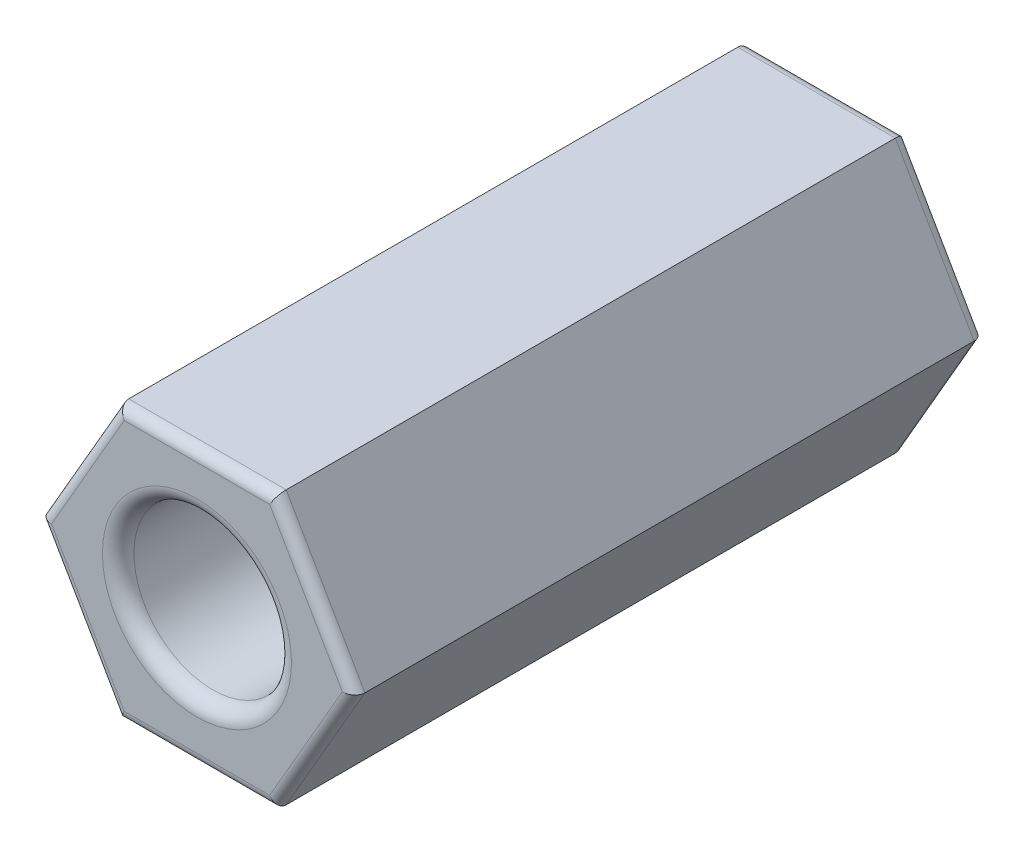
ISO-10303-21;
HEADER;
FILE_DESCRIPTION(('STEP AP214'),'2;1');
FILE_NAME('part.step','',(''),(''),'','','');
FILE_SCHEMA(('AUTOMOTIVE_DESIGN { 1 0 10303 214 1 1 1 1 }'));
ENDSEC;
DATA;
#1=APPLICATION_CONTEXT('core data for automotive mechanical design processes');
#2=APPLICATION_PROTOCOL_DEFINITION('international standard','automotive_design',2000,#1);
#3=PRODUCT_CONTEXT('',#1,'mechanical');
#4=PRODUCT('Part','Part','',(#3));
#5=PRODUCT_RELATED_PRODUCT_CATEGORY('part','',(#4));
#6=PRODUCT_DEFINITION_FORMATION('','',#4);
#7=PRODUCT_DEFINITION_CONTEXT('part definition',#1,'design');
#8=PRODUCT_DEFINITION('design','',#6,#7);
#9=PRODUCT_DEFINITION_SHAPE('','',#8);
#10=(LENGTH_UNIT() NAMED_UNIT(*) SI_UNIT(.MILLI.,.METRE.));
#11=(NAMED_UNIT(*) PLANE_ANGLE_UNIT() SI_UNIT($,.RADIAN.));
#12=(NAMED_UNIT(*) SI_UNIT($,.STERADIAN.) SOLID_ANGLE_UNIT());
#13=UNCERTAINTY_MEASURE_WITH_UNIT(LENGTH_MEASURE(1.E-05),#10,'distance_accuracy_value','');
#14=(GEOMETRIC_REPRESENTATION_CONTEXT(3) GLOBAL_UNCERTAINTY_ASSIGNED_CONTEXT((#13)) GLOBAL_UNIT_ASSIGNED_CONTEXT((#10,
#11,#12)) REPRESENTATION_CONTEXT('',''));
#15=CARTESIAN_POINT('',(0.,0.,0.));
#16=DIRECTION('',(0.,0.,1.));
#17=DIRECTION('',(1.,0.,0.));
#18=AXIS2_PLACEMENT_3D('',#15,#16,#17);
#19=CARTESIAN_POINT('',(0.,0.,12.));
#20=DIRECTION('',(0.,0.,1.));
#21=DIRECTION('',(1.,0.,0.));
#22=AXIS2_PLACEMENT_3D('',#19,#20,#21);
#23=PLANE('',#22);
#24=DIRECTION('',(-1.,0.,0.));
#25=VECTOR('',#24,1.);
#26=CARTESIAN_POINT('',(-1.50000000000001,2.39807621135331,12.));
#27=LINE('',#26,#25);
#28=CARTESIAN_POINT('',(1.38452994616207,2.39807621135332,12.));
#29=VERTEX_POINT('',#28);
#30=CARTESIAN_POINT('',(-1.38452994616209,2.39807621135331,12.));
#31=VERTEX_POINT('',#30);
#32=EDGE_CURVE('E128',#29,#31,#27,.T.);
#33=ORIENTED_EDGE('',*,*,#32,.T.);
#34=DIRECTION('',(-0.499999999999995,-0.866025403784442,0.));
#35=VECTOR('',#34,1.);
#36=CARTESIAN_POINT('',(-2.82679491924311,-0.10000000000002,12.));
#37=LINE('',#36,#35);
#38=CARTESIAN_POINT('',(-2.76905989232415,0.,12.));
#39=VERTEX_POINT('',#38);
#40=EDGE_CURVE('E161',#31,#39,#37,.T.);
#41=ORIENTED_EDGE('',*,*,#40,.T.);
#42=DIRECTION('',(0.500000000000007,-0.866025403784434,0.));
#43=VECTOR('',#42,1.);
#44=CARTESIAN_POINT('',(-1.32679491924309,-2.49807621135333,12.));
#45=LINE('',#44,#43);
#46=CARTESIAN_POINT('',(-1.38452994616205,-2.39807621135333,12.));
#47=VERTEX_POINT('',#46);
#48=EDGE_CURVE('E159',#39,#47,#45,.T.);
#49=ORIENTED_EDGE('',*,*,#48,.T.);
#50=DIRECTION('',(1.,0.,0.));
#51=VECTOR('',#50,1.);
#52=CARTESIAN_POINT('',(1.50000000000003,-2.3980762113533,12.));
#53=LINE('',#52,#51);
#54=CARTESIAN_POINT('',(1.3845299461621,-2.3980762113533,12.));
#55=VERTEX_POINT('',#54);
#56=EDGE_CURVE('E157',#47,#55,#53,.T.);
#57=ORIENTED_EDGE('',*,*,#56,.T.);
#58=DIRECTION('',(0.499999999999995,0.866025403784442,0.));
#59=VECTOR('',#58,1.);
#60=CARTESIAN_POINT('',(2.82679491924311,0.0999999999999996,12.));
#61=LINE('',#60,#59);
#62=CARTESIAN_POINT('',(2.76905989232415,0.,12.));
#63=VERTEX_POINT('',#62);
#64=EDGE_CURVE('E131',#55,#63,#61,.T.);
#65=ORIENTED_EDGE('',*,*,#64,.T.);
#66=DIRECTION('',(-0.500000000000001,0.866025403784438,0.));
#67=VECTOR('',#66,1.);
#68=CARTESIAN_POINT('',(1.32679491924311,2.49807621135332,12.));
#69=LINE('',#68,#67);
#70=EDGE_CURVE('E123',#63,#29,#69,.T.);
#71=ORIENTED_EDGE('',*,*,#70,.T.);
#72=EDGE_LOOP('',(#33,#41,#49,#57,#65,#71));
#73=FACE_BOUND('',#72,.T.);
#74=CARTESIAN_POINT('',(0.,0.,12.));
#75=DIRECTION('',(0.,0.,1.));
#76=DIRECTION('',(1.,0.,0.));
#77=AXIS2_PLACEMENT_3D('',#74,#75,#76);
#78=CIRCLE('',#77,1.8);
#79=CARTESIAN_POINT('',(1.8,0.,12.));
#80=VERTEX_POINT('',#79);
#81=EDGE_CURVE('E149',#80,#80,#78,.F.);
#82=ORIENTED_EDGE('',*,*,#81,.T.);
#83=EDGE_LOOP('',(#82));
#84=FACE_BOUND('',#83,.T.);
#85=ADVANCED_FACE('F33',(#73,#84),#23,.T.);
#86=CARTESIAN_POINT('',(0.,0.,0.));
#87=DIRECTION('',(0.,0.,1.));
#88=DIRECTION('',(1.,0.,0.));
#89=AXIS2_PLACEMENT_3D('',#86,#87,#88);
#90=PLANE('',#89);
#91=DIRECTION('',(-0.500000000000001,0.866025403784438,0.));
#92=VECTOR('',#91,1.);
#93=CARTESIAN_POINT('',(2.07679491924311,1.19903810567666,0.));
#94=LINE('',#93,#92);
#95=CARTESIAN_POINT('',(1.38452994616207,2.39807621135332,0.));
#96=VERTEX_POINT('',#95);
#97=CARTESIAN_POINT('',(2.76905989232415,0.,0.));
#98=VERTEX_POINT('',#97);
#99=EDGE_CURVE('E188',#96,#98,#94,.F.);
#100=ORIENTED_EDGE('',*,*,#99,.T.);
#101=DIRECTION('',(0.499999999999995,0.866025403784442,0.));
#102=VECTOR('',#101,1.);
#103=CARTESIAN_POINT('',(2.07679491924313,-1.19903810567665,0.));
#104=LINE('',#103,#102);
#105=CARTESIAN_POINT('',(1.3845299461621,-2.3980762113533,0.));
#106=VERTEX_POINT('',#105);
#107=EDGE_CURVE('E11',#98,#106,#104,.F.);
#108=ORIENTED_EDGE('',*,*,#107,.T.);
#109=DIRECTION('',(1.,0.,0.));
#110=VECTOR('',#109,1.);
#111=CARTESIAN_POINT('',(0.,-2.39807621135331,0.));
#112=LINE('',#111,#110);
#113=CARTESIAN_POINT('',(-1.38452994616205,-2.39807621135333,0.));
#114=VERTEX_POINT('',#113);
#115=EDGE_CURVE('E42',#106,#114,#112,.F.);
#116=ORIENTED_EDGE('',*,*,#115,.T.);
#117=DIRECTION('',(0.500000000000007,-0.866025403784434,0.));
#118=VECTOR('',#117,1.);
#119=CARTESIAN_POINT('',(-2.0767949192431,-1.19903810567667,0.));
#120=LINE('',#119,#118);
#121=CARTESIAN_POINT('',(-2.76905989232415,0.,0.));
#122=VERTEX_POINT('',#121);
#123=EDGE_CURVE('E194',#114,#122,#120,.F.);
#124=ORIENTED_EDGE('',*,*,#123,.T.);
#125=DIRECTION('',(-0.499999999999995,-0.866025403784442,0.));
#126=VECTOR('',#125,1.);
#127=CARTESIAN_POINT('',(-2.07679491924312,1.19903810567665,0.));
#128=LINE('',#127,#126);
#129=CARTESIAN_POINT('',(-1.38452994616209,2.39807621135331,0.));
#130=VERTEX_POINT('',#129);
#131=EDGE_CURVE('E192',#122,#130,#128,.F.);
#132=ORIENTED_EDGE('',*,*,#131,.T.);
#133=DIRECTION('',(-1.,0.,0.));
#134=VECTOR('',#133,1.);
#135=CARTESIAN_POINT('',(0.,2.39807621135331,0.));
#136=LINE('',#135,#134);
#137=EDGE_CURVE('E190',#130,#96,#136,.F.);
#138=ORIENTED_EDGE('',*,*,#137,.T.);
#139=EDGE_LOOP('',(#100,#108,#116,#124,#132,#138));
#140=FACE_BOUND('',#139,.T.);
#141=CARTESIAN_POINT('',(0.,0.,0.));
#142=DIRECTION('',(0.,0.,1.));
#143=DIRECTION('',(1.,0.,0.));
#144=AXIS2_PLACEMENT_3D('',#141,#142,#143);
#145=CIRCLE('',#144,1.8);
#146=CARTESIAN_POINT('',(1.8,0.,0.));
#147=VERTEX_POINT('',#146);
#148=EDGE_CURVE('E252',#147,#147,#145,.T.);
#149=ORIENTED_EDGE('',*,*,#148,.T.);
#150=EDGE_LOOP('',(#149));
#151=FACE_BOUND('',#150,.T.);
#152=ADVANCED_FACE('F230',(#140,#151),#90,.F.);
#153=CARTESIAN_POINT('',(1.50000000000003,-2.5980762113533,12.));
#154=DIRECTION('',(-0.866025403784441,0.499999999999995,0.));
#155=DIRECTION('',(-0.499999999999995,-0.866025403784442,0.));
#156=AXIS2_PLACEMENT_3D('',#153,#154,#155);
#157=PLANE('',#156);
#158=DIRECTION('',(0.,0.,-1.));
#159=VECTOR('',#158,1.);
#160=CARTESIAN_POINT('',(3.,0.,12.));
#161=LINE('',#160,#159);
#162=CARTESIAN_POINT('',(3.,0.,11.8));
#163=VERTEX_POINT('',#162);
#164=CARTESIAN_POINT('',(3.,0.,0.200000000000001));
#165=VERTEX_POINT('',#164);
#166=EDGE_CURVE('E245',#163,#165,#161,.T.);
#167=ORIENTED_EDGE('',*,*,#166,.F.);
#168=DIRECTION('',(0.499999999999995,0.866025403784442,0.));
#169=VECTOR('',#168,1.);
#170=CARTESIAN_POINT('',(1.50000000000003,-2.5980762113533,11.8));
#171=LINE('',#170,#169);
#172=CARTESIAN_POINT('',(1.50000000000003,-2.5980762113533,11.8));
#173=VERTEX_POINT('',#172);
#174=EDGE_CURVE('E179',#163,#173,#171,.F.);
#175=ORIENTED_EDGE('',*,*,#174,.T.);
#176=DIRECTION('',(0.,0.,-1.));
#177=VECTOR('',#176,1.);
#178=CARTESIAN_POINT('',(1.50000000000003,-2.5980762113533,12.));
#179=LINE('',#178,#177);
#180=CARTESIAN_POINT('',(1.50000000000003,-2.5980762113533,0.200000000000001));
#181=VERTEX_POINT('',#180);
#182=EDGE_CURVE('E206',#173,#181,#179,.T.);
#183=ORIENTED_EDGE('',*,*,#182,.T.);
#184=DIRECTION('',(0.499999999999995,0.866025403784442,0.));
#185=VECTOR('',#184,1.);
#186=CARTESIAN_POINT('',(1.50000000000003,-2.5980762113533,0.200000000000001));
#187=LINE('',#186,#185);
#188=EDGE_CURVE('E176',#181,#165,#187,.T.);
#189=ORIENTED_EDGE('',*,*,#188,.T.);
#190=EDGE_LOOP('',(#167,#175,#183,#189));
#191=FACE_BOUND('',#190,.T.);
#192=ADVANCED_FACE('F244',(#191),#157,.F.);
#193=CARTESIAN_POINT('',(3.,0.,12.));
#194=DIRECTION('',(-0.866025403784438,-0.500000000000001,0.));
#195=DIRECTION('',(0.500000000000001,-0.866025403784438,0.));
#196=AXIS2_PLACEMENT_3D('',#193,#194,#195);
#197=PLANE('',#196);
#198=DIRECTION('',(0.,0.,-1.));
#199=VECTOR('',#198,1.);
#200=CARTESIAN_POINT('',(1.49999999999999,2.59807621135332,12.));
#201=LINE('',#200,#199);
#202=CARTESIAN_POINT('',(1.49999999999999,2.59807621135332,11.8));
#203=VERTEX_POINT('',#202);
#204=CARTESIAN_POINT('',(1.49999999999999,2.59807621135332,0.200000000000001));
#205=VERTEX_POINT('',#204);
#206=EDGE_CURVE('E253',#203,#205,#201,.T.);
#207=ORIENTED_EDGE('',*,*,#206,.F.);
#208=DIRECTION('',(-0.500000000000001,0.866025403784438,0.));
#209=VECTOR('',#208,1.);
#210=CARTESIAN_POINT('',(3.,0.,11.8));
#211=LINE('',#210,#209);
#212=EDGE_CURVE('E140',#203,#163,#211,.F.);
#213=ORIENTED_EDGE('',*,*,#212,.T.);
#214=ORIENTED_EDGE('',*,*,#166,.T.);
#215=DIRECTION('',(-0.500000000000001,0.866025403784438,0.));
#216=VECTOR('',#215,1.);
#217=CARTESIAN_POINT('',(3.,0.,0.200000000000001));
#218=LINE('',#217,#216);
#219=EDGE_CURVE('E181',#165,#205,#218,.T.);
#220=ORIENTED_EDGE('',*,*,#219,.T.);
#221=EDGE_LOOP('',(#207,#213,#214,#220));
#222=FACE_BOUND('',#221,.T.);
#223=ADVANCED_FACE('F250',(#222),#197,.F.);
#224=CARTESIAN_POINT('',(1.49999999999999,2.59807621135332,12.));
#225=DIRECTION('',(0.,-1.,0.));
#226=DIRECTION('',(1.,0.,0.));
#227=AXIS2_PLACEMENT_3D('',#224,#225,#226);
#228=PLANE('',#227);
#229=DIRECTION('',(0.,0.,-1.));
#230=VECTOR('',#229,1.);
#231=CARTESIAN_POINT('',(-1.50000000000001,2.59807621135331,12.));
#232=LINE('',#231,#230);
#233=CARTESIAN_POINT('',(-1.50000000000001,2.59807621135331,11.8));
#234=VERTEX_POINT('',#233);
#235=CARTESIAN_POINT('',(-1.50000000000001,2.59807621135331,0.200000000000001));
#236=VERTEX_POINT('',#235);
#237=EDGE_CURVE('E258',#234,#236,#232,.T.);
#238=ORIENTED_EDGE('',*,*,#237,.F.);
#239=DIRECTION('',(-1.,0.,0.));
#240=VECTOR('',#239,1.);
#241=CARTESIAN_POINT('',(1.49999999999999,2.59807621135332,11.8));
#242=LINE('',#241,#240);
#243=EDGE_CURVE('E186',#234,#203,#242,.F.);
#244=ORIENTED_EDGE('',*,*,#243,.T.);
#245=ORIENTED_EDGE('',*,*,#206,.T.);
#246=DIRECTION('',(-1.,0.,0.));
#247=VECTOR('',#246,1.);
#248=CARTESIAN_POINT('',(1.49999999999999,2.59807621135332,0.200000000000001));
#249=LINE('',#248,#247);
#250=EDGE_CURVE('E184',#205,#236,#249,.T.);
#251=ORIENTED_EDGE('',*,*,#250,.T.);
#252=EDGE_LOOP('',(#238,#244,#245,#251));
#253=FACE_BOUND('',#252,.T.);
#254=ADVANCED_FACE('F296',(#253),#228,.F.);
#255=CARTESIAN_POINT('',(-1.50000000000001,2.59807621135331,12.));
#256=DIRECTION('',(0.866025403784442,-0.499999999999995,0.));
#257=DIRECTION('',(0.499999999999995,0.866025403784442,0.));
#258=AXIS2_PLACEMENT_3D('',#255,#256,#257);
#259=PLANE('',#258);
#260=DIRECTION('',(0.,0.,-1.));
#261=VECTOR('',#260,1.);
#262=CARTESIAN_POINT('',(-3.,0.,12.));
#263=LINE('',#262,#261);
#264=CARTESIAN_POINT('',(-3.,0.,11.8));
#265=VERTEX_POINT('',#264);
#266=CARTESIAN_POINT('',(-3.,0.,0.200000000000001));
#267=VERTEX_POINT('',#266);
#268=EDGE_CURVE('E481',#265,#267,#263,.T.);
#269=ORIENTED_EDGE('',*,*,#268,.F.);
#270=DIRECTION('',(-0.499999999999995,-0.866025403784442,0.));
#271=VECTOR('',#270,1.);
#272=CARTESIAN_POINT('',(-1.50000000000001,2.59807621135331,11.8));
#273=LINE('',#272,#271);
#274=EDGE_CURVE('E165',#265,#234,#273,.F.);
#275=ORIENTED_EDGE('',*,*,#274,.T.);
#276=ORIENTED_EDGE('',*,*,#237,.T.);
#277=DIRECTION('',(-0.499999999999995,-0.866025403784442,0.));
#278=VECTOR('',#277,1.);
#279=CARTESIAN_POINT('',(-1.50000000000001,2.59807621135331,0.200000000000001));
#280=LINE('',#279,#278);
#281=EDGE_CURVE('E163',#236,#267,#280,.T.);
#282=ORIENTED_EDGE('',*,*,#281,.T.);
#283=EDGE_LOOP('',(#269,#275,#276,#282));
#284=FACE_BOUND('',#283,.T.);
#285=ADVANCED_FACE('F292',(#284),#259,.F.);
#286=CARTESIAN_POINT('',(-3.,0.,12.));
#287=DIRECTION('',(0.866025403784435,0.500000000000007,0.));
#288=DIRECTION('',(-0.500000000000007,0.866025403784434,0.));
#289=AXIS2_PLACEMENT_3D('',#286,#287,#288);
#290=PLANE('',#289);
#291=DIRECTION('',(0.,0.,-1.));
#292=VECTOR('',#291,1.);
#293=CARTESIAN_POINT('',(-1.49999999999998,-2.59807621135333,12.));
#294=LINE('',#293,#292);
#295=CARTESIAN_POINT('',(-1.49999999999998,-2.59807621135333,11.8));
#296=VERTEX_POINT('',#295);
#297=CARTESIAN_POINT('',(-1.49999999999998,-2.59807621135333,0.200000000000001));
#298=VERTEX_POINT('',#297);
#299=EDGE_CURVE('E478',#296,#298,#294,.T.);
#300=ORIENTED_EDGE('',*,*,#299,.F.);
#301=DIRECTION('',(0.500000000000007,-0.866025403784434,0.));
#302=VECTOR('',#301,1.);
#303=CARTESIAN_POINT('',(-3.,0.,11.8));
#304=LINE('',#303,#302);
#305=EDGE_CURVE('E170',#296,#265,#304,.F.);
#306=ORIENTED_EDGE('',*,*,#305,.T.);
#307=ORIENTED_EDGE('',*,*,#268,.T.);
#308=DIRECTION('',(0.500000000000007,-0.866025403784434,0.));
#309=VECTOR('',#308,1.);
#310=CARTESIAN_POINT('',(-3.,0.,0.200000000000001));
#311=LINE('',#310,#309);
#312=EDGE_CURVE('E168',#267,#298,#311,.T.);
#313=ORIENTED_EDGE('',*,*,#312,.T.);
#314=EDGE_LOOP('',(#300,#306,#307,#313));
#315=FACE_BOUND('',#314,.T.);
#316=ADVANCED_FACE('F288',(#315),#290,.F.);
#317=CARTESIAN_POINT('',(-1.49999999999998,-2.59807621135333,12.));
#318=DIRECTION('',(0.,1.,0.));
#319=DIRECTION('',(-1.,0.,0.));
#320=AXIS2_PLACEMENT_3D('',#317,#318,#319);
#321=PLANE('',#320);
#322=ORIENTED_EDGE('',*,*,#182,.F.);
#323=DIRECTION('',(1.,0.,0.));
#324=VECTOR('',#323,1.);
#325=CARTESIAN_POINT('',(-1.49999999999998,-2.59807621135333,11.8));
#326=LINE('',#325,#324);
#327=EDGE_CURVE('E174',#173,#296,#326,.F.);
#328=ORIENTED_EDGE('',*,*,#327,.T.);
#329=ORIENTED_EDGE('',*,*,#299,.T.);
#330=DIRECTION('',(1.,0.,0.));
#331=VECTOR('',#330,1.);
#332=CARTESIAN_POINT('',(-1.49999999999998,-2.59807621135333,0.200000000000001));
#333=LINE('',#332,#331);
#334=EDGE_CURVE('E172',#298,#181,#333,.T.);
#335=ORIENTED_EDGE('',*,*,#334,.T.);
#336=EDGE_LOOP('',(#322,#328,#329,#335));
#337=FACE_BOUND('',#336,.T.);
#338=ADVANCED_FACE('F285',(#337),#321,.F.);
#339=CARTESIAN_POINT('',(0.,0.,12.));
#340=DIRECTION('',(0.,0.,-1.));
#341=DIRECTION('',(-1.,0.,0.));
#342=AXIS2_PLACEMENT_3D('',#339,#340,#341);
#343=CYLINDRICAL_SURFACE('',#342,1.5);
#344=CARTESIAN_POINT('',(0.,0.,0.3));
#345=DIRECTION('',(0.,0.,1.));
#346=DIRECTION('',(1.,0.,0.));
#347=AXIS2_PLACEMENT_3D('',#344,#345,#346);
#348=CIRCLE('',#347,1.5);
#349=CARTESIAN_POINT('',(1.5,0.,0.3));
#350=VERTEX_POINT('',#349);
#351=EDGE_CURVE('E152',#350,#350,#348,.F.);
#352=ORIENTED_EDGE('',*,*,#351,.T.);
#353=EDGE_LOOP('',(#352));
#354=FACE_BOUND('',#353,.T.);
#355=CARTESIAN_POINT('',(0.,0.,11.7));
#356=DIRECTION('',(0.,0.,1.));
#357=DIRECTION('',(1.,0.,0.));
#358=AXIS2_PLACEMENT_3D('',#355,#356,#357);
#359=CIRCLE('',#358,1.5);
#360=CARTESIAN_POINT('',(1.5,0.,11.7));
#361=VERTEX_POINT('',#360);
#362=EDGE_CURVE('E256',#361,#361,#359,.T.);
#363=ORIENTED_EDGE('',*,*,#362,.T.);
#364=EDGE_LOOP('',(#363));
#365=FACE_BOUND('',#364,.T.);
#366=ADVANCED_FACE('F266',(#354,#365),#343,.F.);
#367=CARTESIAN_POINT('',(0.,0.,0.3));
#368=DIRECTION('',(0.,0.,1.));
#369=DIRECTION('',(1.,0.,0.));
#370=AXIS2_PLACEMENT_3D('',#367,#368,#369);
#371=TOROIDAL_SURFACE('',#370,1.8,0.3);
#372=ORIENTED_EDGE('',*,*,#351,.F.);
#373=EDGE_LOOP('',(#372));
#374=FACE_BOUND('',#373,.T.);
#375=ORIENTED_EDGE('',*,*,#148,.F.);
#376=EDGE_LOOP('',(#375));
#377=FACE_BOUND('',#376,.T.);
#378=ADVANCED_FACE('F269',(#374,#377),#371,.T.);
#379=CARTESIAN_POINT('',(0.,0.,11.7));
#380=DIRECTION('',(0.,0.,1.));
#381=DIRECTION('',(1.,0.,0.));
#382=AXIS2_PLACEMENT_3D('',#379,#380,#381);
#383=TOROIDAL_SURFACE('',#382,1.8,0.3);
#384=ORIENTED_EDGE('',*,*,#81,.F.);
#385=EDGE_LOOP('',(#384));
#386=FACE_BOUND('',#385,.T.);
#387=ORIENTED_EDGE('',*,*,#362,.F.);
#388=EDGE_LOOP('',(#387));
#389=FACE_BOUND('',#388,.T.);
#390=ADVANCED_FACE('F272',(#386,#389),#383,.T.);
#391=CARTESIAN_POINT('',(2.07679491924313,-1.19903810567665,11.8));
#392=DIRECTION('',(-0.499999999999995,-0.866025403784442,0.));
#393=DIRECTION('',(0.866025403784441,-0.499999999999995,0.));
#394=AXIS2_PLACEMENT_3D('',#391,#392,#393);
#395=CYLINDRICAL_SURFACE('',#394,0.2);
#396=CARTESIAN_POINT('',(1.3845299461621,-2.3980762113533,11.8));
#397=DIRECTION('',(-0.866025403784435,-0.500000000000007,0.));
#398=DIRECTION('',(0.500000000000007,-0.866025403784435,0.));
#399=AXIS2_PLACEMENT_3D('',#396,#397,#398);
#400=ELLIPSE('',#399,0.23094010767585,0.2);
#401=EDGE_CURVE('E143',#173,#55,#400,.T.);
#402=ORIENTED_EDGE('',*,*,#401,.F.);
#403=ORIENTED_EDGE('',*,*,#174,.F.);
#404=CARTESIAN_POINT('',(2.76905989232415,0.,11.8));
#405=DIRECTION('',(0.,-1.,0.));
#406=DIRECTION('',(1.,0.,0.));
#407=AXIS2_PLACEMENT_3D('',#404,#405,#406);
#408=ELLIPSE('',#407,0.23094010767585,0.2);
#409=EDGE_CURVE('E204',#63,#163,#408,.F.);
#410=ORIENTED_EDGE('',*,*,#409,.F.);
#411=ORIENTED_EDGE('',*,*,#64,.F.);
#412=EDGE_LOOP('',(#402,#403,#410,#411));
#413=FACE_BOUND('',#412,.T.);
#414=ADVANCED_FACE('F305',(#413),#395,.T.);
#415=CARTESIAN_POINT('',(2.07679491924311,1.19903810567666,11.8));
#416=DIRECTION('',(0.500000000000001,-0.866025403784438,0.));
#417=DIRECTION('',(0.866025403784438,0.500000000000001,0.));
#418=AXIS2_PLACEMENT_3D('',#415,#416,#417);
#419=CYLINDRICAL_SURFACE('',#418,0.2);
#420=ORIENTED_EDGE('',*,*,#409,.T.);
#421=ORIENTED_EDGE('',*,*,#212,.F.);
#422=CARTESIAN_POINT('',(1.38452994616207,2.39807621135332,11.8));
#423=DIRECTION('',(0.86602540378444,-0.499999999999998,0.));
#424=DIRECTION('',(0.499999999999998,0.86602540378444,0.));
#425=AXIS2_PLACEMENT_3D('',#422,#423,#424);
#426=ELLIPSE('',#425,0.23094010767585,0.2);
#427=EDGE_CURVE('E138',#29,#203,#426,.F.);
#428=ORIENTED_EDGE('',*,*,#427,.F.);
#429=ORIENTED_EDGE('',*,*,#70,.F.);
#430=EDGE_LOOP('',(#420,#421,#428,#429));
#431=FACE_BOUND('',#430,.T.);
#432=ADVANCED_FACE('F139',(#431),#419,.T.);
#433=CARTESIAN_POINT('',(0.,-2.39807621135331,11.8));
#434=DIRECTION('',(-1.,0.,0.));
#435=DIRECTION('',(0.,-1.,0.));
#436=AXIS2_PLACEMENT_3D('',#433,#434,#435);
#437=CYLINDRICAL_SURFACE('',#436,0.2);
#438=ORIENTED_EDGE('',*,*,#401,.T.);
#439=ORIENTED_EDGE('',*,*,#56,.F.);
#440=CARTESIAN_POINT('',(-1.38452994616205,-2.39807621135333,11.8));
#441=DIRECTION('',(-0.866025403784443,0.499999999999992,0.));
#442=DIRECTION('',(-0.499999999999992,-0.866025403784443,0.));
#443=AXIS2_PLACEMENT_3D('',#440,#441,#442);
#444=ELLIPSE('',#443,0.23094010767585,0.2);
#445=EDGE_CURVE('E144',#296,#47,#444,.T.);
#446=ORIENTED_EDGE('',*,*,#445,.F.);
#447=ORIENTED_EDGE('',*,*,#327,.F.);
#448=EDGE_LOOP('',(#438,#439,#446,#447));
#449=FACE_BOUND('',#448,.T.);
#450=ADVANCED_FACE('F317',(#449),#437,.T.);
#451=CARTESIAN_POINT('',(0.,2.39807621135331,11.8));
#452=DIRECTION('',(1.,0.,0.));
#453=DIRECTION('',(0.,1.,0.));
#454=AXIS2_PLACEMENT_3D('',#451,#452,#453);
#455=CYLINDRICAL_SURFACE('',#454,0.2);
#456=ORIENTED_EDGE('',*,*,#427,.T.);
#457=ORIENTED_EDGE('',*,*,#243,.F.);
#458=CARTESIAN_POINT('',(-1.38452994616209,2.39807621135331,11.8));
#459=DIRECTION('',(0.866025403784436,0.500000000000004,0.));
#460=DIRECTION('',(0.500000000000004,-0.866025403784436,0.));
#461=AXIS2_PLACEMENT_3D('',#458,#459,#460);
#462=ELLIPSE('',#461,0.23094010767585,0.2);
#463=EDGE_CURVE('E147',#31,#234,#462,.F.);
#464=ORIENTED_EDGE('',*,*,#463,.F.);
#465=ORIENTED_EDGE('',*,*,#32,.F.);
#466=EDGE_LOOP('',(#456,#457,#464,#465));
#467=FACE_BOUND('',#466,.T.);
#468=ADVANCED_FACE('F146',(#467),#455,.T.);
#469=CARTESIAN_POINT('',(-2.0767949192431,-1.19903810567667,11.8));
#470=DIRECTION('',(-0.500000000000007,0.866025403784434,0.));
#471=DIRECTION('',(-0.866025403784435,-0.500000000000007,0.));
#472=AXIS2_PLACEMENT_3D('',#469,#470,#471);
#473=CYLINDRICAL_SURFACE('',#472,0.2);
#474=ORIENTED_EDGE('',*,*,#445,.T.);
#475=ORIENTED_EDGE('',*,*,#48,.F.);
#476=CARTESIAN_POINT('',(-2.76905989232415,0.,11.8));
#477=DIRECTION('',(0.,1.,0.));
#478=DIRECTION('',(-1.,0.,0.));
#479=AXIS2_PLACEMENT_3D('',#476,#477,#478);
#480=ELLIPSE('',#479,0.23094010767585,0.2);
#481=EDGE_CURVE('E197',#265,#39,#480,.T.);
#482=ORIENTED_EDGE('',*,*,#481,.F.);
#483=ORIENTED_EDGE('',*,*,#305,.F.);
#484=EDGE_LOOP('',(#474,#475,#482,#483));
#485=FACE_BOUND('',#484,.T.);
#486=ADVANCED_FACE('F310',(#485),#473,.T.);
#487=CARTESIAN_POINT('',(-2.07679491924312,1.19903810567665,11.8));
#488=DIRECTION('',(0.499999999999995,0.866025403784442,0.));
#489=DIRECTION('',(-0.866025403784442,0.499999999999995,0.));
#490=AXIS2_PLACEMENT_3D('',#487,#488,#489);
#491=CYLINDRICAL_SURFACE('',#490,0.2);
#492=ORIENTED_EDGE('',*,*,#463,.T.);
#493=ORIENTED_EDGE('',*,*,#274,.F.);
#494=ORIENTED_EDGE('',*,*,#481,.T.);
#495=ORIENTED_EDGE('',*,*,#40,.F.);
#496=EDGE_LOOP('',(#492,#493,#494,#495));
#497=FACE_BOUND('',#496,.T.);
#498=ADVANCED_FACE('F307',(#497),#491,.T.);
#499=CARTESIAN_POINT('',(-1.32679491924312,2.49807621135331,0.200000000000001));
#500=DIRECTION('',(-0.499999999999995,-0.866025403784442,0.));
#501=DIRECTION('',(0.866025403784442,-0.499999999999995,0.));
#502=AXIS2_PLACEMENT_3D('',#499,#500,#501);
#503=CYLINDRICAL_SURFACE('',#502,0.2);
#504=CARTESIAN_POINT('',(-1.38452994616209,2.39807621135331,0.200000000000001));
#505=DIRECTION('',(-0.866025403784436,-0.500000000000004,0.));
#506=DIRECTION('',(-0.500000000000004,0.866025403784436,0.));
#507=AXIS2_PLACEMENT_3D('',#504,#505,#506);
#508=ELLIPSE('',#507,0.23094010767585,0.2);
#509=EDGE_CURVE('E215',#130,#236,#508,.F.);
#510=ORIENTED_EDGE('',*,*,#509,.F.);
#511=ORIENTED_EDGE('',*,*,#131,.F.);
#512=CARTESIAN_POINT('',(-2.76905989232415,0.,0.200000000000001));
#513=DIRECTION('',(0.,-1.,0.));
#514=DIRECTION('',(-1.,0.,0.));
#515=AXIS2_PLACEMENT_3D('',#512,#513,#514);
#516=ELLIPSE('',#515,0.23094010767585,0.2);
#517=EDGE_CURVE('E37',#267,#122,#516,.T.);
#518=ORIENTED_EDGE('',*,*,#517,.F.);
#519=ORIENTED_EDGE('',*,*,#281,.F.);
#520=EDGE_LOOP('',(#510,#511,#518,#519));
#521=FACE_BOUND('',#520,.T.);
#522=ADVANCED_FACE('F35',(#521),#503,.T.);
#523=CARTESIAN_POINT('',(-2.82679491924311,0.0999999999999805,0.200000000000001));
#524=DIRECTION('',(0.500000000000007,-0.866025403784434,0.));
#525=DIRECTION('',(0.866025403784435,0.500000000000007,0.));
#526=AXIS2_PLACEMENT_3D('',#523,#524,#525);
#527=CYLINDRICAL_SURFACE('',#526,0.2);
#528=ORIENTED_EDGE('',*,*,#517,.T.);
#529=ORIENTED_EDGE('',*,*,#123,.F.);
#530=CARTESIAN_POINT('',(-1.38452994616205,-2.39807621135333,0.200000000000001));
#531=DIRECTION('',(0.866025403784443,-0.499999999999992,0.));
#532=DIRECTION('',(-0.499999999999992,-0.866025403784443,0.));
#533=AXIS2_PLACEMENT_3D('',#530,#531,#532);
#534=ELLIPSE('',#533,0.23094010767585,0.2);
#535=EDGE_CURVE('E213',#298,#114,#534,.T.);
#536=ORIENTED_EDGE('',*,*,#535,.F.);
#537=ORIENTED_EDGE('',*,*,#312,.F.);
#538=EDGE_LOOP('',(#528,#529,#536,#537));
#539=FACE_BOUND('',#538,.T.);
#540=ADVANCED_FACE('F225',(#539),#527,.T.);
#541=CARTESIAN_POINT('',(1.49999999999999,2.39807621135332,0.200000000000001));
#542=DIRECTION('',(-1.,0.,0.));
#543=DIRECTION('',(0.,-1.,0.));
#544=AXIS2_PLACEMENT_3D('',#541,#542,#543);
#545=CYLINDRICAL_SURFACE('',#544,0.2);
#546=ORIENTED_EDGE('',*,*,#509,.T.);
#547=ORIENTED_EDGE('',*,*,#250,.F.);
#548=CARTESIAN_POINT('',(1.38452994616207,2.39807621135332,0.200000000000001));
#549=DIRECTION('',(-0.86602540378444,0.499999999999998,0.));
#550=DIRECTION('',(0.499999999999998,0.86602540378444,0.));
#551=AXIS2_PLACEMENT_3D('',#548,#549,#550);
#552=ELLIPSE('',#551,0.23094010767585,0.2);
#553=EDGE_CURVE('E210',#96,#205,#552,.F.);
#554=ORIENTED_EDGE('',*,*,#553,.F.);
#555=ORIENTED_EDGE('',*,*,#137,.F.);
#556=EDGE_LOOP('',(#546,#547,#554,#555));
#557=FACE_BOUND('',#556,.T.);
#558=ADVANCED_FACE('F234',(#557),#545,.T.);
#559=CARTESIAN_POINT('',(-1.49999999999998,-2.39807621135333,0.200000000000001));
#560=DIRECTION('',(1.,0.,0.));
#561=DIRECTION('',(0.,1.,0.));
#562=AXIS2_PLACEMENT_3D('',#559,#560,#561);
#563=CYLINDRICAL_SURFACE('',#562,0.2);
#564=ORIENTED_EDGE('',*,*,#535,.T.);
#565=ORIENTED_EDGE('',*,*,#115,.F.);
#566=CARTESIAN_POINT('',(1.3845299461621,-2.3980762113533,0.200000000000001));
#567=DIRECTION('',(0.866025403784435,0.500000000000007,0.));
#568=DIRECTION('',(0.500000000000007,-0.866025403784435,0.));
#569=AXIS2_PLACEMENT_3D('',#566,#567,#568);
#570=ELLIPSE('',#569,0.23094010767585,0.2);
#571=EDGE_CURVE('E50',#181,#106,#570,.T.);
#572=ORIENTED_EDGE('',*,*,#571,.F.);
#573=ORIENTED_EDGE('',*,*,#334,.F.);
#574=EDGE_LOOP('',(#564,#565,#572,#573));
#575=FACE_BOUND('',#574,.T.);
#576=ADVANCED_FACE('F330',(#575),#563,.T.);
#577=CARTESIAN_POINT('',(2.82679491924311,-0.1,0.200000000000001));
#578=DIRECTION('',(-0.500000000000001,0.866025403784438,0.));
#579=DIRECTION('',(-0.866025403784438,-0.500000000000001,0.));
#580=AXIS2_PLACEMENT_3D('',#577,#578,#579);
#581=CYLINDRICAL_SURFACE('',#580,0.2);
#582=ORIENTED_EDGE('',*,*,#553,.T.);
#583=ORIENTED_EDGE('',*,*,#219,.F.);
#584=CARTESIAN_POINT('',(2.76905989232415,0.,0.200000000000001));
#585=DIRECTION('',(0.,1.,0.));
#586=DIRECTION('',(-1.,0.,0.));
#587=AXIS2_PLACEMENT_3D('',#584,#585,#586);
#588=ELLIPSE('',#587,0.23094010767585,0.2);
#589=EDGE_CURVE('E207',#98,#165,#588,.F.);
#590=ORIENTED_EDGE('',*,*,#589,.F.);
#591=ORIENTED_EDGE('',*,*,#99,.F.);
#592=EDGE_LOOP('',(#582,#583,#590,#591));
#593=FACE_BOUND('',#592,.T.);
#594=ADVANCED_FACE('F238',(#593),#581,.T.);
#595=CARTESIAN_POINT('',(1.32679491924314,-2.4980762113533,0.200000000000001));
#596=DIRECTION('',(0.499999999999995,0.866025403784442,0.));
#597=DIRECTION('',(-0.866025403784441,0.499999999999995,0.));
#598=AXIS2_PLACEMENT_3D('',#595,#596,#597);
#599=CYLINDRICAL_SURFACE('',#598,0.2);
#600=ORIENTED_EDGE('',*,*,#571,.T.);
#601=ORIENTED_EDGE('',*,*,#107,.F.);
#602=ORIENTED_EDGE('',*,*,#589,.T.);
#603=ORIENTED_EDGE('',*,*,#188,.F.);
#604=EDGE_LOOP('',(#600,#601,#602,#603));
#605=FACE_BOUND('',#604,.T.);
#606=ADVANCED_FACE('F239',(#605),#599,.T.);
#607=CLOSED_SHELL('',(#85,#152,#192,#223,#254,#285,#316,#338,#366,#378,#390,#414,#432,#450,#468,
#486,#498,#522,#540,#558,#576,#594,#606));
#608=MANIFOLD_SOLID_BREP('B2',#607);
#609=ADVANCED_BREP_SHAPE_REPRESENTATION('',(#18,#608),#14);
#610=SHAPE_DEFINITION_REPRESENTATION(#9,#609);
ENDSEC;
END-ISO-10303-21;
